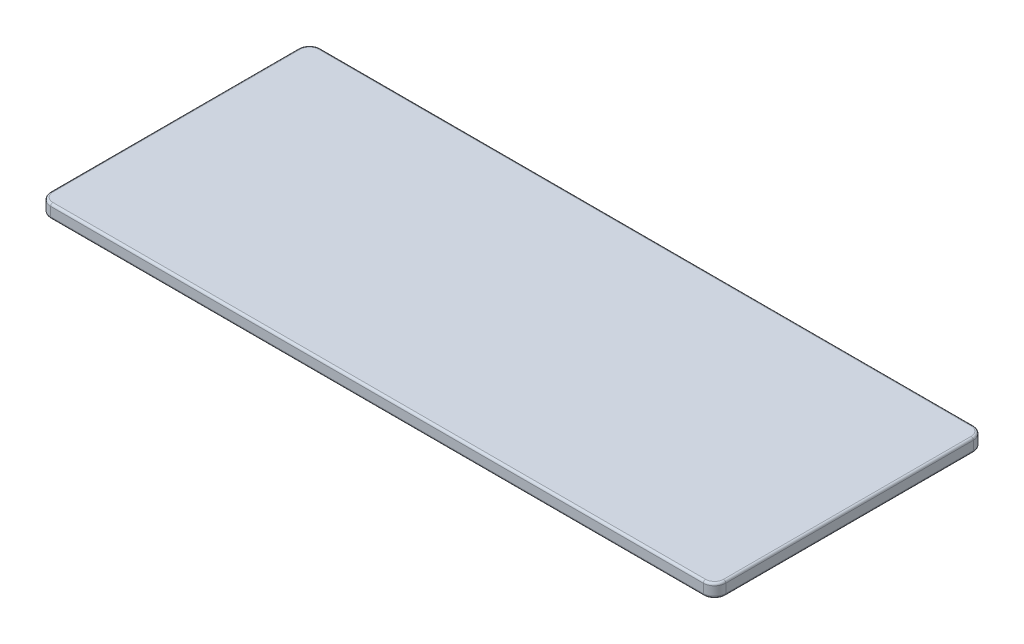
ISO-10303-21;
HEADER;
FILE_DESCRIPTION(('STEP AP214'),'2;1');
FILE_NAME('part.step','',(''),(''),'','','');
FILE_SCHEMA(('AUTOMOTIVE_DESIGN { 1 0 10303 214 1 1 1 1 }'));
ENDSEC;
DATA;
#1=APPLICATION_CONTEXT('core data for automotive mechanical design processes');
#2=APPLICATION_PROTOCOL_DEFINITION('international standard','automotive_design',2000,#1);
#3=PRODUCT_CONTEXT('',#1,'mechanical');
#4=PRODUCT('Part','Part','',(#3));
#5=PRODUCT_RELATED_PRODUCT_CATEGORY('part','',(#4));
#6=PRODUCT_DEFINITION_FORMATION('','',#4);
#7=PRODUCT_DEFINITION_CONTEXT('part definition',#1,'design');
#8=PRODUCT_DEFINITION('design','',#6,#7);
#9=PRODUCT_DEFINITION_SHAPE('','',#8);
#10=(LENGTH_UNIT() NAMED_UNIT(*) SI_UNIT(.MILLI.,.METRE.));
#11=(NAMED_UNIT(*) PLANE_ANGLE_UNIT() SI_UNIT($,.RADIAN.));
#12=(NAMED_UNIT(*) SI_UNIT($,.STERADIAN.) SOLID_ANGLE_UNIT());
#13=UNCERTAINTY_MEASURE_WITH_UNIT(LENGTH_MEASURE(1.E-05),#10,'distance_accuracy_value','');
#14=(GEOMETRIC_REPRESENTATION_CONTEXT(3) GLOBAL_UNCERTAINTY_ASSIGNED_CONTEXT((#13)) GLOBAL_UNIT_ASSIGNED_CONTEXT((#10,
#11,#12)) REPRESENTATION_CONTEXT('',''));
#15=CARTESIAN_POINT('',(0.,0.,0.));
#16=DIRECTION('',(0.,0.,1.));
#17=DIRECTION('',(1.,0.,0.));
#18=AXIS2_PLACEMENT_3D('',#15,#16,#17);
#19=CARTESIAN_POINT('',(750.,30.,-300.));
#20=DIRECTION('',(-1.,0.,0.));
#21=DIRECTION('',(0.,0.,1.));
#22=AXIS2_PLACEMENT_3D('',#19,#20,#21);
#23=PLANE('',#22);
#24=DIRECTION('',(0.,-1.,0.));
#25=VECTOR('',#24,1.);
#26=CARTESIAN_POINT('',(750.,30.,275.));
#27=LINE('',#26,#25);
#28=CARTESIAN_POINT('',(750.,25.,275.));
#29=VERTEX_POINT('',#28);
#30=CARTESIAN_POINT('',(750.,5.,275.));
#31=VERTEX_POINT('',#30);
#32=EDGE_CURVE('E286',#29,#31,#27,.T.);
#33=ORIENTED_EDGE('',*,*,#32,.T.);
#34=DIRECTION('',(0.,0.,-1.));
#35=VECTOR('',#34,1.);
#36=CARTESIAN_POINT('',(750.,5.,-300.));
#37=LINE('',#36,#35);
#38=CARTESIAN_POINT('',(750.,5.,-275.));
#39=VERTEX_POINT('',#38);
#40=EDGE_CURVE('E203',#31,#39,#37,.T.);
#41=ORIENTED_EDGE('',*,*,#40,.T.);
#42=DIRECTION('',(0.,-1.,0.));
#43=VECTOR('',#42,1.);
#44=CARTESIAN_POINT('',(750.,30.,-275.));
#45=LINE('',#44,#43);
#46=CARTESIAN_POINT('',(750.,25.,-275.));
#47=VERTEX_POINT('',#46);
#48=EDGE_CURVE('E291',#39,#47,#45,.F.);
#49=ORIENTED_EDGE('',*,*,#48,.T.);
#50=DIRECTION('',(0.,0.,-1.));
#51=VECTOR('',#50,1.);
#52=CARTESIAN_POINT('',(750.,25.,275.));
#53=LINE('',#52,#51);
#54=EDGE_CURVE('E201',#47,#29,#53,.F.);
#55=ORIENTED_EDGE('',*,*,#54,.T.);
#56=EDGE_LOOP('',(#33,#41,#49,#55));
#57=FACE_BOUND('',#56,.T.);
#58=ADVANCED_FACE('F37',(#57),#23,.F.);
#59=CARTESIAN_POINT('',(-750.,30.,-300.));
#60=DIRECTION('',(0.,0.,1.));
#61=DIRECTION('',(1.,0.,0.));
#62=AXIS2_PLACEMENT_3D('',#59,#60,#61);
#63=PLANE('',#62);
#64=DIRECTION('',(0.,-1.,0.));
#65=VECTOR('',#64,1.);
#66=CARTESIAN_POINT('',(725.,30.,-300.));
#67=LINE('',#66,#65);
#68=CARTESIAN_POINT('',(725.,25.,-300.));
#69=VERTEX_POINT('',#68);
#70=CARTESIAN_POINT('',(725.,5.,-300.));
#71=VERTEX_POINT('',#70);
#72=EDGE_CURVE('E284',#69,#71,#67,.T.);
#73=ORIENTED_EDGE('',*,*,#72,.T.);
#74=DIRECTION('',(-1.,0.,0.));
#75=VECTOR('',#74,1.);
#76=CARTESIAN_POINT('',(-750.,5.,-300.));
#77=LINE('',#76,#75);
#78=CARTESIAN_POINT('',(-725.,5.,-300.));
#79=VERTEX_POINT('',#78);
#80=EDGE_CURVE('E211',#71,#79,#77,.T.);
#81=ORIENTED_EDGE('',*,*,#80,.T.);
#82=DIRECTION('',(0.,-1.,0.));
#83=VECTOR('',#82,1.);
#84=CARTESIAN_POINT('',(-725.,30.,-300.));
#85=LINE('',#84,#83);
#86=CARTESIAN_POINT('',(-725.,25.,-300.));
#87=VERTEX_POINT('',#86);
#88=EDGE_CURVE('E242',#79,#87,#85,.F.);
#89=ORIENTED_EDGE('',*,*,#88,.T.);
#90=DIRECTION('',(-1.,0.,0.));
#91=VECTOR('',#90,1.);
#92=CARTESIAN_POINT('',(725.,25.,-300.));
#93=LINE('',#92,#91);
#94=EDGE_CURVE('E209',#87,#69,#93,.F.);
#95=ORIENTED_EDGE('',*,*,#94,.T.);
#96=EDGE_LOOP('',(#73,#81,#89,#95));
#97=FACE_BOUND('',#96,.T.);
#98=ADVANCED_FACE('F282',(#97),#63,.F.);
#99=CARTESIAN_POINT('',(-750.,30.,-300.));
#100=DIRECTION('',(1.,0.,0.));
#101=DIRECTION('',(0.,0.,-1.));
#102=AXIS2_PLACEMENT_3D('',#99,#100,#101);
#103=PLANE('',#102);
#104=DIRECTION('',(0.,-1.,0.));
#105=VECTOR('',#104,1.);
#106=CARTESIAN_POINT('',(-750.,30.,-275.));
#107=LINE('',#106,#105);
#108=CARTESIAN_POINT('',(-750.,25.,-275.));
#109=VERTEX_POINT('',#108);
#110=CARTESIAN_POINT('',(-750.,5.,-275.));
#111=VERTEX_POINT('',#110);
#112=EDGE_CURVE('E170',#109,#111,#107,.T.);
#113=ORIENTED_EDGE('',*,*,#112,.T.);
#114=DIRECTION('',(0.,0.,1.));
#115=VECTOR('',#114,1.);
#116=CARTESIAN_POINT('',(-750.,5.,-300.));
#117=LINE('',#116,#115);
#118=CARTESIAN_POINT('',(-750.,5.,275.));
#119=VERTEX_POINT('',#118);
#120=EDGE_CURVE('E186',#111,#119,#117,.T.);
#121=ORIENTED_EDGE('',*,*,#120,.T.);
#122=DIRECTION('',(0.,-1.,0.));
#123=VECTOR('',#122,1.);
#124=CARTESIAN_POINT('',(-750.,30.,275.));
#125=LINE('',#124,#123);
#126=CARTESIAN_POINT('',(-750.,25.,275.));
#127=VERTEX_POINT('',#126);
#128=EDGE_CURVE('E300',#119,#127,#125,.F.);
#129=ORIENTED_EDGE('',*,*,#128,.T.);
#130=DIRECTION('',(0.,0.,1.));
#131=VECTOR('',#130,1.);
#132=CARTESIAN_POINT('',(-750.,25.,-275.));
#133=LINE('',#132,#131);
#134=EDGE_CURVE('E184',#127,#109,#133,.F.);
#135=ORIENTED_EDGE('',*,*,#134,.T.);
#136=EDGE_LOOP('',(#113,#121,#129,#135));
#137=FACE_BOUND('',#136,.T.);
#138=ADVANCED_FACE('F322',(#137),#103,.F.);
#139=CARTESIAN_POINT('',(-750.,30.,300.));
#140=DIRECTION('',(0.,0.,-1.));
#141=DIRECTION('',(-1.,0.,0.));
#142=AXIS2_PLACEMENT_3D('',#139,#140,#141);
#143=PLANE('',#142);
#144=DIRECTION('',(0.,-1.,0.));
#145=VECTOR('',#144,1.);
#146=CARTESIAN_POINT('',(-725.,30.,300.));
#147=LINE('',#146,#145);
#148=CARTESIAN_POINT('',(-725.,25.,300.));
#149=VERTEX_POINT('',#148);
#150=CARTESIAN_POINT('',(-725.,5.,300.));
#151=VERTEX_POINT('',#150);
#152=EDGE_CURVE('E294',#149,#151,#147,.T.);
#153=ORIENTED_EDGE('',*,*,#152,.T.);
#154=DIRECTION('',(1.,0.,0.));
#155=VECTOR('',#154,1.);
#156=CARTESIAN_POINT('',(-750.,5.,300.));
#157=LINE('',#156,#155);
#158=CARTESIAN_POINT('',(725.,5.,300.));
#159=VERTEX_POINT('',#158);
#160=EDGE_CURVE('E194',#151,#159,#157,.T.);
#161=ORIENTED_EDGE('',*,*,#160,.T.);
#162=DIRECTION('',(0.,-1.,0.));
#163=VECTOR('',#162,1.);
#164=CARTESIAN_POINT('',(725.,30.,300.));
#165=LINE('',#164,#163);
#166=CARTESIAN_POINT('',(725.,25.,300.));
#167=VERTEX_POINT('',#166);
#168=EDGE_CURVE('E297',#159,#167,#165,.F.);
#169=ORIENTED_EDGE('',*,*,#168,.T.);
#170=DIRECTION('',(1.,0.,0.));
#171=VECTOR('',#170,1.);
#172=CARTESIAN_POINT('',(-725.,25.,300.));
#173=LINE('',#172,#171);
#174=EDGE_CURVE('E192',#167,#149,#173,.F.);
#175=ORIENTED_EDGE('',*,*,#174,.T.);
#176=EDGE_LOOP('',(#153,#161,#169,#175));
#177=FACE_BOUND('',#176,.T.);
#178=ADVANCED_FACE('F365',(#177),#143,.F.);
#179=CARTESIAN_POINT('',(0.,30.,0.));
#180=DIRECTION('',(0.,1.,0.));
#181=DIRECTION('',(0.,0.,1.));
#182=AXIS2_PLACEMENT_3D('',#179,#180,#181);
#183=PLANE('',#182);
#184=DIRECTION('',(1.,0.,0.));
#185=VECTOR('',#184,1.);
#186=CARTESIAN_POINT('',(725.,30.,295.));
#187=LINE('',#186,#185);
#188=CARTESIAN_POINT('',(-725.,30.,295.));
#189=VERTEX_POINT('',#188);
#190=CARTESIAN_POINT('',(725.,30.,295.));
#191=VERTEX_POINT('',#190);
#192=EDGE_CURVE('E46',#189,#191,#187,.T.);
#193=ORIENTED_EDGE('',*,*,#192,.T.);
#194=CARTESIAN_POINT('',(725.,30.,275.));
#195=DIRECTION('',(0.,1.,0.));
#196=DIRECTION('',(0.,0.,1.));
#197=AXIS2_PLACEMENT_3D('',#194,#195,#196);
#198=CIRCLE('',#197,20.);
#199=CARTESIAN_POINT('',(745.,30.,275.));
#200=VERTEX_POINT('',#199);
#201=EDGE_CURVE('E11',#191,#200,#198,.T.);
#202=ORIENTED_EDGE('',*,*,#201,.T.);
#203=DIRECTION('',(0.,0.,-1.));
#204=VECTOR('',#203,1.);
#205=CARTESIAN_POINT('',(745.,30.,-275.));
#206=LINE('',#205,#204);
#207=CARTESIAN_POINT('',(745.,30.,-275.));
#208=VERTEX_POINT('',#207);
#209=EDGE_CURVE('E213',#200,#208,#206,.T.);
#210=ORIENTED_EDGE('',*,*,#209,.T.);
#211=CARTESIAN_POINT('',(725.,30.,-275.));
#212=DIRECTION('',(0.,1.,0.));
#213=DIRECTION('',(0.,0.,1.));
#214=AXIS2_PLACEMENT_3D('',#211,#212,#213);
#215=CIRCLE('',#214,20.);
#216=CARTESIAN_POINT('',(725.,30.,-295.));
#217=VERTEX_POINT('',#216);
#218=EDGE_CURVE('E215',#208,#217,#215,.T.);
#219=ORIENTED_EDGE('',*,*,#218,.T.);
#220=DIRECTION('',(-1.,0.,0.));
#221=VECTOR('',#220,1.);
#222=CARTESIAN_POINT('',(-725.,30.,-295.));
#223=LINE('',#222,#221);
#224=CARTESIAN_POINT('',(-725.,30.,-295.));
#225=VERTEX_POINT('',#224);
#226=EDGE_CURVE('E217',#217,#225,#223,.T.);
#227=ORIENTED_EDGE('',*,*,#226,.T.);
#228=CARTESIAN_POINT('',(-725.,30.,-275.));
#229=DIRECTION('',(0.,1.,0.));
#230=DIRECTION('',(0.,0.,1.));
#231=AXIS2_PLACEMENT_3D('',#228,#229,#230);
#232=CIRCLE('',#231,20.);
#233=CARTESIAN_POINT('',(-745.,30.,-275.));
#234=VERTEX_POINT('',#233);
#235=EDGE_CURVE('E219',#225,#234,#232,.T.);
#236=ORIENTED_EDGE('',*,*,#235,.T.);
#237=DIRECTION('',(0.,0.,1.));
#238=VECTOR('',#237,1.);
#239=CARTESIAN_POINT('',(-745.,30.,275.));
#240=LINE('',#239,#238);
#241=CARTESIAN_POINT('',(-745.,30.,275.));
#242=VERTEX_POINT('',#241);
#243=EDGE_CURVE('E221',#234,#242,#240,.T.);
#244=ORIENTED_EDGE('',*,*,#243,.T.);
#245=CARTESIAN_POINT('',(-725.,30.,275.));
#246=DIRECTION('',(0.,1.,0.));
#247=DIRECTION('',(0.,0.,1.));
#248=AXIS2_PLACEMENT_3D('',#245,#246,#247);
#249=CIRCLE('',#248,20.);
#250=EDGE_CURVE('E57',#242,#189,#249,.T.);
#251=ORIENTED_EDGE('',*,*,#250,.T.);
#252=EDGE_LOOP('',(#193,#202,#210,#219,#227,#236,#244,#251));
#253=FACE_BOUND('',#252,.T.);
#254=ADVANCED_FACE('F338',(#253),#183,.T.);
#255=CARTESIAN_POINT('',(0.,0.,0.));
#256=DIRECTION('',(0.,1.,0.));
#257=DIRECTION('',(0.,0.,1.));
#258=AXIS2_PLACEMENT_3D('',#255,#256,#257);
#259=PLANE('',#258);
#260=DIRECTION('',(0.,0.,1.));
#261=VECTOR('',#260,1.);
#262=CARTESIAN_POINT('',(-745.,0.,0.));
#263=LINE('',#262,#261);
#264=CARTESIAN_POINT('',(-745.,0.,275.));
#265=VERTEX_POINT('',#264);
#266=CARTESIAN_POINT('',(-745.,0.,-275.));
#267=VERTEX_POINT('',#266);
#268=EDGE_CURVE('E174',#265,#267,#263,.F.);
#269=ORIENTED_EDGE('',*,*,#268,.T.);
#270=CARTESIAN_POINT('',(-725.,0.,-275.));
#271=DIRECTION('',(0.,1.,0.));
#272=DIRECTION('',(0.,0.,1.));
#273=AXIS2_PLACEMENT_3D('',#270,#271,#272);
#274=CIRCLE('',#273,20.);
#275=CARTESIAN_POINT('',(-725.,0.,-295.));
#276=VERTEX_POINT('',#275);
#277=EDGE_CURVE('E155',#267,#276,#274,.F.);
#278=ORIENTED_EDGE('',*,*,#277,.T.);
#279=DIRECTION('',(-1.,0.,0.));
#280=VECTOR('',#279,1.);
#281=CARTESIAN_POINT('',(0.,0.,-295.));
#282=LINE('',#281,#280);
#283=CARTESIAN_POINT('',(725.,0.,-295.));
#284=VERTEX_POINT('',#283);
#285=EDGE_CURVE('E163',#276,#284,#282,.F.);
#286=ORIENTED_EDGE('',*,*,#285,.T.);
#287=CARTESIAN_POINT('',(725.,0.,-275.));
#288=DIRECTION('',(0.,1.,0.));
#289=DIRECTION('',(0.,0.,1.));
#290=AXIS2_PLACEMENT_3D('',#287,#288,#289);
#291=CIRCLE('',#290,20.);
#292=CARTESIAN_POINT('',(745.,0.,-275.));
#293=VERTEX_POINT('',#292);
#294=EDGE_CURVE('E169',#284,#293,#291,.F.);
#295=ORIENTED_EDGE('',*,*,#294,.T.);
#296=DIRECTION('',(0.,0.,-1.));
#297=VECTOR('',#296,1.);
#298=CARTESIAN_POINT('',(745.,0.,0.));
#299=LINE('',#298,#297);
#300=CARTESIAN_POINT('',(745.,0.,275.));
#301=VERTEX_POINT('',#300);
#302=EDGE_CURVE('E305',#293,#301,#299,.F.);
#303=ORIENTED_EDGE('',*,*,#302,.T.);
#304=CARTESIAN_POINT('',(725.,0.,275.));
#305=DIRECTION('',(0.,1.,0.));
#306=DIRECTION('',(0.,0.,1.));
#307=AXIS2_PLACEMENT_3D('',#304,#305,#306);
#308=CIRCLE('',#307,20.);
#309=CARTESIAN_POINT('',(725.,0.,295.));
#310=VERTEX_POINT('',#309);
#311=EDGE_CURVE('E307',#301,#310,#308,.F.);
#312=ORIENTED_EDGE('',*,*,#311,.T.);
#313=DIRECTION('',(1.,0.,0.));
#314=VECTOR('',#313,1.);
#315=CARTESIAN_POINT('',(0.,0.,295.));
#316=LINE('',#315,#314);
#317=CARTESIAN_POINT('',(-725.,0.,295.));
#318=VERTEX_POINT('',#317);
#319=EDGE_CURVE('E309',#310,#318,#316,.F.);
#320=ORIENTED_EDGE('',*,*,#319,.T.);
#321=CARTESIAN_POINT('',(-725.,0.,275.));
#322=DIRECTION('',(0.,1.,0.));
#323=DIRECTION('',(0.,0.,1.));
#324=AXIS2_PLACEMENT_3D('',#321,#322,#323);
#325=CIRCLE('',#324,20.);
#326=EDGE_CURVE('E179',#318,#265,#325,.F.);
#327=ORIENTED_EDGE('',*,*,#326,.T.);
#328=EDGE_LOOP('',(#269,#278,#286,#295,#303,#312,#320,#327));
#329=FACE_BOUND('',#328,.T.);
#330=ADVANCED_FACE('F172',(#329),#259,.F.);
#331=CARTESIAN_POINT('',(725.,30.,-275.));
#332=DIRECTION('',(0.,-1.,0.));
#333=DIRECTION('',(0.,0.,-1.));
#334=AXIS2_PLACEMENT_3D('',#331,#332,#333);
#335=CYLINDRICAL_SURFACE('',#334,25.);
#336=ORIENTED_EDGE('',*,*,#48,.F.);
#337=CARTESIAN_POINT('',(725.,5.,-275.));
#338=DIRECTION('',(0.,1.,0.));
#339=DIRECTION('',(0.,0.,1.));
#340=AXIS2_PLACEMENT_3D('',#337,#338,#339);
#341=CIRCLE('',#340,25.);
#342=EDGE_CURVE('E207',#39,#71,#341,.T.);
#343=ORIENTED_EDGE('',*,*,#342,.T.);
#344=ORIENTED_EDGE('',*,*,#72,.F.);
#345=CARTESIAN_POINT('',(725.,25.,-275.));
#346=DIRECTION('',(0.,1.,0.));
#347=DIRECTION('',(0.,0.,1.));
#348=AXIS2_PLACEMENT_3D('',#345,#346,#347);
#349=CIRCLE('',#348,25.);
#350=EDGE_CURVE('E205',#69,#47,#349,.F.);
#351=ORIENTED_EDGE('',*,*,#350,.T.);
#352=EDGE_LOOP('',(#336,#343,#344,#351));
#353=FACE_BOUND('',#352,.T.);
#354=ADVANCED_FACE('F382',(#353),#335,.T.);
#355=CARTESIAN_POINT('',(725.,30.,275.));
#356=DIRECTION('',(0.,-1.,0.));
#357=DIRECTION('',(0.,0.,-1.));
#358=AXIS2_PLACEMENT_3D('',#355,#356,#357);
#359=CYLINDRICAL_SURFACE('',#358,25.);
#360=ORIENTED_EDGE('',*,*,#168,.F.);
#361=CARTESIAN_POINT('',(725.,5.,275.));
#362=DIRECTION('',(0.,1.,0.));
#363=DIRECTION('',(0.,0.,1.));
#364=AXIS2_PLACEMENT_3D('',#361,#362,#363);
#365=CIRCLE('',#364,25.);
#366=EDGE_CURVE('E199',#159,#31,#365,.T.);
#367=ORIENTED_EDGE('',*,*,#366,.T.);
#368=ORIENTED_EDGE('',*,*,#32,.F.);
#369=CARTESIAN_POINT('',(725.,25.,275.));
#370=DIRECTION('',(0.,1.,0.));
#371=DIRECTION('',(0.,0.,1.));
#372=AXIS2_PLACEMENT_3D('',#369,#370,#371);
#373=CIRCLE('',#372,25.);
#374=EDGE_CURVE('E196',#29,#167,#373,.F.);
#375=ORIENTED_EDGE('',*,*,#374,.T.);
#376=EDGE_LOOP('',(#360,#367,#368,#375));
#377=FACE_BOUND('',#376,.T.);
#378=ADVANCED_FACE('F354',(#377),#359,.T.);
#379=CARTESIAN_POINT('',(-725.,30.,-275.));
#380=DIRECTION('',(0.,-1.,0.));
#381=DIRECTION('',(0.,0.,-1.));
#382=AXIS2_PLACEMENT_3D('',#379,#380,#381);
#383=CYLINDRICAL_SURFACE('',#382,25.);
#384=ORIENTED_EDGE('',*,*,#88,.F.);
#385=CARTESIAN_POINT('',(-725.,5.,-275.));
#386=DIRECTION('',(0.,1.,0.));
#387=DIRECTION('',(0.,0.,1.));
#388=AXIS2_PLACEMENT_3D('',#385,#386,#387);
#389=CIRCLE('',#388,25.);
#390=EDGE_CURVE('E157',#79,#111,#389,.T.);
#391=ORIENTED_EDGE('',*,*,#390,.T.);
#392=ORIENTED_EDGE('',*,*,#112,.F.);
#393=CARTESIAN_POINT('',(-725.,25.,-275.));
#394=DIRECTION('',(0.,1.,0.));
#395=DIRECTION('',(0.,0.,1.));
#396=AXIS2_PLACEMENT_3D('',#393,#394,#395);
#397=CIRCLE('',#396,25.);
#398=EDGE_CURVE('E176',#109,#87,#397,.F.);
#399=ORIENTED_EDGE('',*,*,#398,.T.);
#400=EDGE_LOOP('',(#384,#391,#392,#399));
#401=FACE_BOUND('',#400,.T.);
#402=ADVANCED_FACE('F278',(#401),#383,.T.);
#403=CARTESIAN_POINT('',(-725.,30.,275.));
#404=DIRECTION('',(0.,-1.,0.));
#405=DIRECTION('',(0.,0.,-1.));
#406=AXIS2_PLACEMENT_3D('',#403,#404,#405);
#407=CYLINDRICAL_SURFACE('',#406,25.);
#408=ORIENTED_EDGE('',*,*,#128,.F.);
#409=CARTESIAN_POINT('',(-725.,5.,275.));
#410=DIRECTION('',(0.,1.,0.));
#411=DIRECTION('',(0.,0.,1.));
#412=AXIS2_PLACEMENT_3D('',#409,#410,#411);
#413=CIRCLE('',#412,25.);
#414=EDGE_CURVE('E190',#119,#151,#413,.T.);
#415=ORIENTED_EDGE('',*,*,#414,.T.);
#416=ORIENTED_EDGE('',*,*,#152,.F.);
#417=CARTESIAN_POINT('',(-725.,25.,275.));
#418=DIRECTION('',(0.,1.,0.));
#419=DIRECTION('',(0.,0.,1.));
#420=AXIS2_PLACEMENT_3D('',#417,#418,#419);
#421=CIRCLE('',#420,25.);
#422=EDGE_CURVE('E188',#149,#127,#421,.F.);
#423=ORIENTED_EDGE('',*,*,#422,.T.);
#424=EDGE_LOOP('',(#408,#415,#416,#423));
#425=FACE_BOUND('',#424,.T.);
#426=ADVANCED_FACE('F324',(#425),#407,.T.);
#427=CARTESIAN_POINT('',(725.,5.,275.));
#428=DIRECTION('',(0.,1.,0.));
#429=DIRECTION('',(0.,0.,1.));
#430=AXIS2_PLACEMENT_3D('',#427,#428,#429);
#431=TOROIDAL_SURFACE('',#430,20.,5.);
#432=CARTESIAN_POINT('',(745.,5.,275.));
#433=DIRECTION('',(0.,0.,-1.));
#434=DIRECTION('',(-1.,0.,0.));
#435=AXIS2_PLACEMENT_3D('',#432,#433,#434);
#436=CIRCLE('',#435,5.);
#437=EDGE_CURVE('E236',#31,#301,#436,.T.);
#438=ORIENTED_EDGE('',*,*,#437,.F.);
#439=ORIENTED_EDGE('',*,*,#366,.F.);
#440=CARTESIAN_POINT('',(725.,5.,295.));
#441=DIRECTION('',(-1.,0.,0.));
#442=DIRECTION('',(0.,0.,1.));
#443=AXIS2_PLACEMENT_3D('',#440,#441,#442);
#444=CIRCLE('',#443,5.);
#445=EDGE_CURVE('E239',#310,#159,#444,.T.);
#446=ORIENTED_EDGE('',*,*,#445,.F.);
#447=ORIENTED_EDGE('',*,*,#311,.F.);
#448=EDGE_LOOP('',(#438,#439,#446,#447));
#449=FACE_BOUND('',#448,.T.);
#450=ADVANCED_FACE('F358',(#449),#431,.T.);
#451=CARTESIAN_POINT('',(-750.,5.,295.));
#452=DIRECTION('',(1.,0.,0.));
#453=DIRECTION('',(0.,0.,-1.));
#454=AXIS2_PLACEMENT_3D('',#451,#452,#453);
#455=CYLINDRICAL_SURFACE('',#454,5.);
#456=ORIENTED_EDGE('',*,*,#445,.T.);
#457=ORIENTED_EDGE('',*,*,#160,.F.);
#458=CARTESIAN_POINT('',(-725.,5.,295.));
#459=DIRECTION('',(-1.,0.,0.));
#460=DIRECTION('',(0.,0.,1.));
#461=AXIS2_PLACEMENT_3D('',#458,#459,#460);
#462=CIRCLE('',#461,5.);
#463=EDGE_CURVE('E233',#318,#151,#462,.T.);
#464=ORIENTED_EDGE('',*,*,#463,.F.);
#465=ORIENTED_EDGE('',*,*,#319,.F.);
#466=EDGE_LOOP('',(#456,#457,#464,#465));
#467=FACE_BOUND('',#466,.T.);
#468=ADVANCED_FACE('F363',(#467),#455,.T.);
#469=CARTESIAN_POINT('',(745.,5.,-300.));
#470=DIRECTION('',(0.,0.,-1.));
#471=DIRECTION('',(-1.,0.,0.));
#472=AXIS2_PLACEMENT_3D('',#469,#470,#471);
#473=CYLINDRICAL_SURFACE('',#472,5.);
#474=ORIENTED_EDGE('',*,*,#437,.T.);
#475=ORIENTED_EDGE('',*,*,#302,.F.);
#476=CARTESIAN_POINT('',(745.,5.,-275.));
#477=DIRECTION('',(0.,0.,-1.));
#478=DIRECTION('',(-1.,0.,0.));
#479=AXIS2_PLACEMENT_3D('',#476,#477,#478);
#480=CIRCLE('',#479,5.);
#481=EDGE_CURVE('E230',#39,#293,#480,.T.);
#482=ORIENTED_EDGE('',*,*,#481,.F.);
#483=ORIENTED_EDGE('',*,*,#40,.F.);
#484=EDGE_LOOP('',(#474,#475,#482,#483));
#485=FACE_BOUND('',#484,.T.);
#486=ADVANCED_FACE('F404',(#485),#473,.T.);
#487=CARTESIAN_POINT('',(-725.,5.,275.));
#488=DIRECTION('',(0.,1.,0.));
#489=DIRECTION('',(0.,0.,1.));
#490=AXIS2_PLACEMENT_3D('',#487,#488,#489);
#491=TOROIDAL_SURFACE('',#490,20.,5.);
#492=ORIENTED_EDGE('',*,*,#463,.T.);
#493=ORIENTED_EDGE('',*,*,#414,.F.);
#494=CARTESIAN_POINT('',(-745.,5.,275.));
#495=DIRECTION('',(0.,0.,-1.));
#496=DIRECTION('',(-1.,0.,0.));
#497=AXIS2_PLACEMENT_3D('',#494,#495,#496);
#498=CIRCLE('',#497,5.);
#499=EDGE_CURVE('E227',#265,#119,#498,.T.);
#500=ORIENTED_EDGE('',*,*,#499,.F.);
#501=ORIENTED_EDGE('',*,*,#326,.F.);
#502=EDGE_LOOP('',(#492,#493,#500,#501));
#503=FACE_BOUND('',#502,.T.);
#504=ADVANCED_FACE('F316',(#503),#491,.T.);
#505=CARTESIAN_POINT('',(725.,5.,-275.));
#506=DIRECTION('',(0.,1.,0.));
#507=DIRECTION('',(0.,0.,1.));
#508=AXIS2_PLACEMENT_3D('',#505,#506,#507);
#509=TOROIDAL_SURFACE('',#508,20.,5.);
#510=ORIENTED_EDGE('',*,*,#481,.T.);
#511=ORIENTED_EDGE('',*,*,#294,.F.);
#512=CARTESIAN_POINT('',(725.,5.,-295.));
#513=DIRECTION('',(-1.,0.,0.));
#514=DIRECTION('',(0.,0.,1.));
#515=AXIS2_PLACEMENT_3D('',#512,#513,#514);
#516=CIRCLE('',#515,5.);
#517=EDGE_CURVE('E166',#71,#284,#516,.T.);
#518=ORIENTED_EDGE('',*,*,#517,.F.);
#519=ORIENTED_EDGE('',*,*,#342,.F.);
#520=EDGE_LOOP('',(#510,#511,#518,#519));
#521=FACE_BOUND('',#520,.T.);
#522=ADVANCED_FACE('F398',(#521),#509,.T.);
#523=CARTESIAN_POINT('',(-745.,5.,-300.));
#524=DIRECTION('',(0.,0.,1.));
#525=DIRECTION('',(1.,0.,0.));
#526=AXIS2_PLACEMENT_3D('',#523,#524,#525);
#527=CYLINDRICAL_SURFACE('',#526,5.);
#528=ORIENTED_EDGE('',*,*,#499,.T.);
#529=ORIENTED_EDGE('',*,*,#120,.F.);
#530=CARTESIAN_POINT('',(-745.,5.,-275.));
#531=DIRECTION('',(0.,0.,-1.));
#532=DIRECTION('',(-1.,0.,0.));
#533=AXIS2_PLACEMENT_3D('',#530,#531,#532);
#534=CIRCLE('',#533,5.);
#535=EDGE_CURVE('E160',#267,#111,#534,.T.);
#536=ORIENTED_EDGE('',*,*,#535,.F.);
#537=ORIENTED_EDGE('',*,*,#268,.F.);
#538=EDGE_LOOP('',(#528,#529,#536,#537));
#539=FACE_BOUND('',#538,.T.);
#540=ADVANCED_FACE('F319',(#539),#527,.T.);
#541=CARTESIAN_POINT('',(-750.,5.,-295.));
#542=DIRECTION('',(-1.,0.,0.));
#543=DIRECTION('',(0.,0.,1.));
#544=AXIS2_PLACEMENT_3D('',#541,#542,#543);
#545=CYLINDRICAL_SURFACE('',#544,5.);
#546=ORIENTED_EDGE('',*,*,#517,.T.);
#547=ORIENTED_EDGE('',*,*,#285,.F.);
#548=CARTESIAN_POINT('',(-725.,5.,-295.));
#549=DIRECTION('',(-1.,0.,0.));
#550=DIRECTION('',(0.,0.,1.));
#551=AXIS2_PLACEMENT_3D('',#548,#549,#550);
#552=CIRCLE('',#551,5.);
#553=EDGE_CURVE('E151',#79,#276,#552,.T.);
#554=ORIENTED_EDGE('',*,*,#553,.F.);
#555=ORIENTED_EDGE('',*,*,#80,.F.);
#556=EDGE_LOOP('',(#546,#547,#554,#555));
#557=FACE_BOUND('',#556,.T.);
#558=ADVANCED_FACE('F164',(#557),#545,.T.);
#559=CARTESIAN_POINT('',(-725.,5.,-275.));
#560=DIRECTION('',(0.,1.,0.));
#561=DIRECTION('',(0.,0.,1.));
#562=AXIS2_PLACEMENT_3D('',#559,#560,#561);
#563=TOROIDAL_SURFACE('',#562,20.,5.);
#564=ORIENTED_EDGE('',*,*,#535,.T.);
#565=ORIENTED_EDGE('',*,*,#390,.F.);
#566=ORIENTED_EDGE('',*,*,#553,.T.);
#567=ORIENTED_EDGE('',*,*,#277,.F.);
#568=EDGE_LOOP('',(#564,#565,#566,#567));
#569=FACE_BOUND('',#568,.T.);
#570=ADVANCED_FACE('F153',(#569),#563,.T.);
#571=CARTESIAN_POINT('',(-725.,25.,-275.));
#572=DIRECTION('',(0.,1.,0.));
#573=DIRECTION('',(0.,0.,1.));
#574=AXIS2_PLACEMENT_3D('',#571,#572,#573);
#575=TOROIDAL_SURFACE('',#574,20.,5.);
#576=CARTESIAN_POINT('',(-725.,25.,-295.));
#577=DIRECTION('',(1.,0.,0.));
#578=DIRECTION('',(0.,0.,-1.));
#579=AXIS2_PLACEMENT_3D('',#576,#577,#578);
#580=CIRCLE('',#579,5.);
#581=EDGE_CURVE('E258',#87,#225,#580,.T.);
#582=ORIENTED_EDGE('',*,*,#581,.F.);
#583=ORIENTED_EDGE('',*,*,#398,.F.);
#584=CARTESIAN_POINT('',(-745.,25.,-275.));
#585=DIRECTION('',(0.,0.,1.));
#586=DIRECTION('',(1.,0.,0.));
#587=AXIS2_PLACEMENT_3D('',#584,#585,#586);
#588=CIRCLE('',#587,5.);
#589=EDGE_CURVE('E41',#234,#109,#588,.T.);
#590=ORIENTED_EDGE('',*,*,#589,.F.);
#591=ORIENTED_EDGE('',*,*,#235,.F.);
#592=EDGE_LOOP('',(#582,#583,#590,#591));
#593=FACE_BOUND('',#592,.T.);
#594=ADVANCED_FACE('F39',(#593),#575,.T.);
#595=CARTESIAN_POINT('',(-745.,25.,0.));
#596=DIRECTION('',(0.,0.,-1.));
#597=DIRECTION('',(-1.,0.,0.));
#598=AXIS2_PLACEMENT_3D('',#595,#596,#597);
#599=CYLINDRICAL_SURFACE('',#598,5.);
#600=ORIENTED_EDGE('',*,*,#589,.T.);
#601=ORIENTED_EDGE('',*,*,#134,.F.);
#602=CARTESIAN_POINT('',(-745.,25.,275.));
#603=DIRECTION('',(0.,0.,1.));
#604=DIRECTION('',(1.,0.,0.));
#605=AXIS2_PLACEMENT_3D('',#602,#603,#604);
#606=CIRCLE('',#605,5.);
#607=EDGE_CURVE('E256',#242,#127,#606,.T.);
#608=ORIENTED_EDGE('',*,*,#607,.F.);
#609=ORIENTED_EDGE('',*,*,#243,.F.);
#610=EDGE_LOOP('',(#600,#601,#608,#609));
#611=FACE_BOUND('',#610,.T.);
#612=ADVANCED_FACE('F269',(#611),#599,.T.);
#613=CARTESIAN_POINT('',(0.,25.,-295.));
#614=DIRECTION('',(1.,0.,0.));
#615=DIRECTION('',(0.,0.,-1.));
#616=AXIS2_PLACEMENT_3D('',#613,#614,#615);
#617=CYLINDRICAL_SURFACE('',#616,5.);
#618=ORIENTED_EDGE('',*,*,#581,.T.);
#619=ORIENTED_EDGE('',*,*,#226,.F.);
#620=CARTESIAN_POINT('',(725.,25.,-295.));
#621=DIRECTION('',(1.,0.,0.));
#622=DIRECTION('',(0.,0.,-1.));
#623=AXIS2_PLACEMENT_3D('',#620,#621,#622);
#624=CIRCLE('',#623,5.);
#625=EDGE_CURVE('E253',#69,#217,#624,.T.);
#626=ORIENTED_EDGE('',*,*,#625,.F.);
#627=ORIENTED_EDGE('',*,*,#94,.F.);
#628=EDGE_LOOP('',(#618,#619,#626,#627));
#629=FACE_BOUND('',#628,.T.);
#630=ADVANCED_FACE('F422',(#629),#617,.T.);
#631=CARTESIAN_POINT('',(-725.,25.,275.));
#632=DIRECTION('',(0.,1.,0.));
#633=DIRECTION('',(0.,0.,1.));
#634=AXIS2_PLACEMENT_3D('',#631,#632,#633);
#635=TOROIDAL_SURFACE('',#634,20.,5.);
#636=ORIENTED_EDGE('',*,*,#607,.T.);
#637=ORIENTED_EDGE('',*,*,#422,.F.);
#638=CARTESIAN_POINT('',(-725.,25.,295.));
#639=DIRECTION('',(1.,0.,0.));
#640=DIRECTION('',(0.,0.,-1.));
#641=AXIS2_PLACEMENT_3D('',#638,#639,#640);
#642=CIRCLE('',#641,5.);
#643=EDGE_CURVE('E250',#189,#149,#642,.T.);
#644=ORIENTED_EDGE('',*,*,#643,.F.);
#645=ORIENTED_EDGE('',*,*,#250,.F.);
#646=EDGE_LOOP('',(#636,#637,#644,#645));
#647=FACE_BOUND('',#646,.T.);
#648=ADVANCED_FACE('F328',(#647),#635,.T.);
#649=CARTESIAN_POINT('',(725.,25.,-275.));
#650=DIRECTION('',(0.,1.,0.));
#651=DIRECTION('',(0.,0.,1.));
#652=AXIS2_PLACEMENT_3D('',#649,#650,#651);
#653=TOROIDAL_SURFACE('',#652,20.,5.);
#654=ORIENTED_EDGE('',*,*,#625,.T.);
#655=ORIENTED_EDGE('',*,*,#218,.F.);
#656=CARTESIAN_POINT('',(745.,25.,-275.));
#657=DIRECTION('',(0.,0.,1.));
#658=DIRECTION('',(1.,0.,0.));
#659=AXIS2_PLACEMENT_3D('',#656,#657,#658);
#660=CIRCLE('',#659,5.);
#661=EDGE_CURVE('E247',#47,#208,#660,.T.);
#662=ORIENTED_EDGE('',*,*,#661,.F.);
#663=ORIENTED_EDGE('',*,*,#350,.F.);
#664=EDGE_LOOP('',(#654,#655,#662,#663));
#665=FACE_BOUND('',#664,.T.);
#666=ADVANCED_FACE('F343',(#665),#653,.T.);
#667=CARTESIAN_POINT('',(0.,25.,295.));
#668=DIRECTION('',(-1.,0.,0.));
#669=DIRECTION('',(0.,0.,1.));
#670=AXIS2_PLACEMENT_3D('',#667,#668,#669);
#671=CYLINDRICAL_SURFACE('',#670,5.);
#672=ORIENTED_EDGE('',*,*,#643,.T.);
#673=ORIENTED_EDGE('',*,*,#174,.F.);
#674=CARTESIAN_POINT('',(725.,25.,295.));
#675=DIRECTION('',(1.,0.,0.));
#676=DIRECTION('',(0.,0.,-1.));
#677=AXIS2_PLACEMENT_3D('',#674,#675,#676);
#678=CIRCLE('',#677,5.);
#679=EDGE_CURVE('E245',#191,#167,#678,.T.);
#680=ORIENTED_EDGE('',*,*,#679,.F.);
#681=ORIENTED_EDGE('',*,*,#192,.F.);
#682=EDGE_LOOP('',(#672,#673,#680,#681));
#683=FACE_BOUND('',#682,.T.);
#684=ADVANCED_FACE('F331',(#683),#671,.T.);
#685=CARTESIAN_POINT('',(745.,25.,0.));
#686=DIRECTION('',(0.,0.,1.));
#687=DIRECTION('',(1.,0.,0.));
#688=AXIS2_PLACEMENT_3D('',#685,#686,#687);
#689=CYLINDRICAL_SURFACE('',#688,5.);
#690=ORIENTED_EDGE('',*,*,#661,.T.);
#691=ORIENTED_EDGE('',*,*,#209,.F.);
#692=CARTESIAN_POINT('',(745.,25.,275.));
#693=DIRECTION('',(0.,0.,1.));
#694=DIRECTION('',(1.,0.,0.));
#695=AXIS2_PLACEMENT_3D('',#692,#693,#694);
#696=CIRCLE('',#695,5.);
#697=EDGE_CURVE('E243',#29,#200,#696,.T.);
#698=ORIENTED_EDGE('',*,*,#697,.F.);
#699=ORIENTED_EDGE('',*,*,#54,.F.);
#700=EDGE_LOOP('',(#690,#691,#698,#699));
#701=FACE_BOUND('',#700,.T.);
#702=ADVANCED_FACE('F347',(#701),#689,.T.);
#703=CARTESIAN_POINT('',(725.,25.,275.));
#704=DIRECTION('',(0.,1.,0.));
#705=DIRECTION('',(0.,0.,1.));
#706=AXIS2_PLACEMENT_3D('',#703,#704,#705);
#707=TOROIDAL_SURFACE('',#706,20.,5.);
#708=ORIENTED_EDGE('',*,*,#679,.T.);
#709=ORIENTED_EDGE('',*,*,#374,.F.);
#710=ORIENTED_EDGE('',*,*,#697,.T.);
#711=ORIENTED_EDGE('',*,*,#201,.F.);
#712=EDGE_LOOP('',(#708,#709,#710,#711));
#713=FACE_BOUND('',#712,.T.);
#714=ADVANCED_FACE('F335',(#713),#707,.T.);
#715=CLOSED_SHELL('',(#58,#98,#138,#178,#254,#330,#354,#378,#402,#426,#450,#468,#486,#504,#522,
#540,#558,#570,#594,#612,#630,#648,#666,#684,#702,#714));
#716=MANIFOLD_SOLID_BREP('B2',#715);
#717=ADVANCED_BREP_SHAPE_REPRESENTATION('',(#18,#716),#14);
#718=SHAPE_DEFINITION_REPRESENTATION(#9,#717);
ENDSEC;
END-ISO-10303-21;
